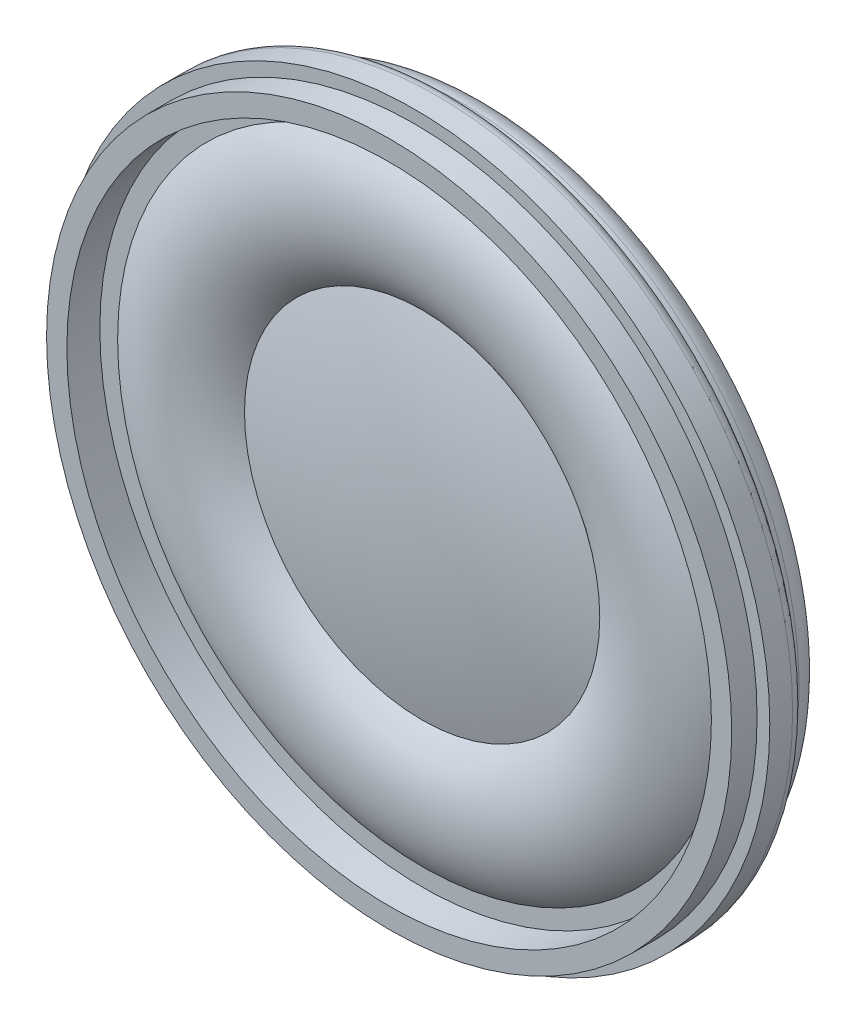
ISO-10303-21;
HEADER;
FILE_DESCRIPTION(('STEP AP214'),'2;1');
FILE_NAME('part.step','',(''),(''),'','','');
FILE_SCHEMA(('AUTOMOTIVE_DESIGN { 1 0 10303 214 1 1 1 1 }'));
ENDSEC;
DATA;
#1=APPLICATION_CONTEXT('core data for automotive mechanical design processes');
#2=APPLICATION_PROTOCOL_DEFINITION('international standard','automotive_design',2000,#1);
#3=PRODUCT_CONTEXT('',#1,'mechanical');
#4=PRODUCT('Part','Part','',(#3));
#5=PRODUCT_RELATED_PRODUCT_CATEGORY('part','',(#4));
#6=PRODUCT_DEFINITION_FORMATION('','',#4);
#7=PRODUCT_DEFINITION_CONTEXT('part definition',#1,'design');
#8=PRODUCT_DEFINITION('design','',#6,#7);
#9=PRODUCT_DEFINITION_SHAPE('','',#8);
#10=(LENGTH_UNIT() NAMED_UNIT(*) SI_UNIT(.MILLI.,.METRE.));
#11=(NAMED_UNIT(*) PLANE_ANGLE_UNIT() SI_UNIT($,.RADIAN.));
#12=(NAMED_UNIT(*) SI_UNIT($,.STERADIAN.) SOLID_ANGLE_UNIT());
#13=UNCERTAINTY_MEASURE_WITH_UNIT(LENGTH_MEASURE(1.E-05),#10,'distance_accuracy_value','');
#14=(GEOMETRIC_REPRESENTATION_CONTEXT(3) GLOBAL_UNCERTAINTY_ASSIGNED_CONTEXT((#13)) GLOBAL_UNIT_ASSIGNED_CONTEXT((#10,
#11,#12)) REPRESENTATION_CONTEXT('',''));
#15=CARTESIAN_POINT('',(0.,0.,0.));
#16=DIRECTION('',(0.,0.,1.));
#17=DIRECTION('',(1.,0.,0.));
#18=AXIS2_PLACEMENT_3D('',#15,#16,#17);
#19=CARTESIAN_POINT('',(8.,0.,1.5));
#20=DIRECTION('',(0.,0.,1.));
#21=DIRECTION('',(1.,0.,0.));
#22=AXIS2_PLACEMENT_3D('',#19,#20,#21);
#23=PLANE('',#22);
#24=CARTESIAN_POINT('',(0.,0.,1.5));
#25=DIRECTION('',(0.,0.,-1.));
#26=DIRECTION('',(-1.,0.,0.));
#27=AXIS2_PLACEMENT_3D('',#24,#25,#26);
#28=CIRCLE('',#27,12.25);
#29=CARTESIAN_POINT('',(-12.25,0.,1.5));
#30=VERTEX_POINT('',#29);
#31=EDGE_CURVE('E115',#30,#30,#28,.T.);
#32=ORIENTED_EDGE('',*,*,#31,.T.);
#33=EDGE_LOOP('',(#32));
#34=FACE_BOUND('',#33,.T.);
#35=CARTESIAN_POINT('',(0.,0.,1.5));
#36=DIRECTION('',(0.,0.,-1.));
#37=DIRECTION('',(-1.,0.,0.));
#38=AXIS2_PLACEMENT_3D('',#35,#36,#37);
#39=CIRCLE('',#38,8.);
#40=CARTESIAN_POINT('',(-8.,0.,1.5));
#41=VERTEX_POINT('',#40);
#42=EDGE_CURVE('E112',#41,#41,#39,.T.);
#43=ORIENTED_EDGE('',*,*,#42,.F.);
#44=EDGE_LOOP('',(#43));
#45=FACE_BOUND('',#44,.T.);
#46=CARTESIAN_POINT('',(0.,0.,1.5));
#47=DIRECTION('',(0.,0.,1.));
#48=DIRECTION('',(-1.,0.,0.));
#49=AXIS2_PLACEMENT_3D('',#46,#47,#48);
#50=CIRCLE('',#49,8.62499999999999);
#51=CARTESIAN_POINT('',(5.56451612903226,6.58990024581099,1.5));
#52=VERTEX_POINT('',#51);
#53=CARTESIAN_POINT('',(-5.56451612903225,6.58990024581099,1.5));
#54=VERTEX_POINT('',#53);
#55=EDGE_CURVE('E100',#52,#54,#50,.T.);
#56=ORIENTED_EDGE('',*,*,#55,.F.);
#57=DIRECTION('',(-0.645161290322581,-0.76404640531142,0.));
#58=VECTOR('',#57,1.);
#59=CARTESIAN_POINT('',(5.56451612903226,6.58990024581099,1.5));
#60=LINE('',#59,#58);
#61=CARTESIAN_POINT('',(7.5,8.88203946174525,1.5));
#62=VERTEX_POINT('',#61);
#63=EDGE_CURVE('E97',#62,#52,#60,.T.);
#64=ORIENTED_EDGE('',*,*,#63,.F.);
#65=CARTESIAN_POINT('',(0.,0.,1.5));
#66=DIRECTION('',(0.,0.,-1.));
#67=DIRECTION('',(-1.,0.,0.));
#68=AXIS2_PLACEMENT_3D('',#65,#66,#67);
#69=CIRCLE('',#68,11.625);
#70=CARTESIAN_POINT('',(-7.5,8.88203946174526,1.5));
#71=VERTEX_POINT('',#70);
#72=EDGE_CURVE('E59',#71,#62,#69,.T.);
#73=ORIENTED_EDGE('',*,*,#72,.F.);
#74=DIRECTION('',(-0.645161290322581,0.76404640531142,0.));
#75=VECTOR('',#74,1.);
#76=CARTESIAN_POINT('',(-5.56451612903226,6.58990024581099,1.5));
#77=LINE('',#76,#75);
#78=EDGE_CURVE('E54',#54,#71,#77,.T.);
#79=ORIENTED_EDGE('',*,*,#78,.F.);
#80=EDGE_LOOP('',(#56,#64,#73,#79));
#81=FACE_BOUND('',#80,.T.);
#82=ADVANCED_FACE('F39',(#34,#45,#81),#23,.F.);
#83=CARTESIAN_POINT('',(0.,0.,-22.6722222222223));
#84=DIRECTION('',(0.,0.,-1.));
#85=DIRECTION('',(1.,0.,0.));
#86=AXIS2_PLACEMENT_3D('',#83,#84,#85);
#87=SPHERICAL_SURFACE('',#86,27.6722222222223);
#88=CARTESIAN_POINT('',(0.,0.,4.1));
#89=DIRECTION('',(0.,0.,-1.));
#90=DIRECTION('',(-1.,0.,0.));
#91=AXIS2_PLACEMENT_3D('',#88,#89,#90);
#92=CIRCLE('',#91,7.);
#93=CARTESIAN_POINT('',(-7.,0.,4.1));
#94=VERTEX_POINT('',#93);
#95=EDGE_CURVE('E11',#94,#94,#92,.T.);
#96=ORIENTED_EDGE('',*,*,#95,.F.);
#97=EDGE_LOOP('',(#96));
#98=FACE_BOUND('',#97,.T.);
#99=ADVANCED_FACE('F41',(#98),#87,.T.);
#100=CARTESIAN_POINT('',(0.,0.,1.07777777777778));
#101=DIRECTION('',(0.,0.,-1.));
#102=DIRECTION('',(-1.,0.,0.));
#103=AXIS2_PLACEMENT_3D('',#100,#101,#102);
#104=TOROIDAL_SURFACE('',#103,9.5,3.92222222222222);
#105=CARTESIAN_POINT('',(0.,0.,4.1));
#106=DIRECTION('',(0.,0.,-1.));
#107=DIRECTION('',(-1.,0.,0.));
#108=AXIS2_PLACEMENT_3D('',#105,#106,#107);
#109=CIRCLE('',#108,12.);
#110=CARTESIAN_POINT('',(-12.,0.,4.1));
#111=VERTEX_POINT('',#110);
#112=EDGE_CURVE('E47',#111,#111,#109,.T.);
#113=ORIENTED_EDGE('',*,*,#112,.F.);
#114=EDGE_LOOP('',(#113));
#115=FACE_BOUND('',#114,.T.);
#116=ORIENTED_EDGE('',*,*,#95,.T.);
#117=EDGE_LOOP('',(#116));
#118=FACE_BOUND('',#117,.T.);
#119=ADVANCED_FACE('F149',(#115,#118),#104,.T.);
#120=CARTESIAN_POINT('',(12.7,0.,4.1));
#121=DIRECTION('',(0.,0.,-1.));
#122=DIRECTION('',(-1.,0.,0.));
#123=AXIS2_PLACEMENT_3D('',#120,#121,#122);
#124=PLANE('',#123);
#125=CARTESIAN_POINT('',(0.,0.,4.1));
#126=DIRECTION('',(0.,0.,-1.));
#127=DIRECTION('',(-1.,0.,0.));
#128=AXIS2_PLACEMENT_3D('',#125,#126,#127);
#129=CIRCLE('',#128,12.7);
#130=CARTESIAN_POINT('',(-12.7,0.,4.10000000000001));
#131=VERTEX_POINT('',#130);
#132=EDGE_CURVE('E142',#131,#131,#129,.T.);
#133=ORIENTED_EDGE('',*,*,#132,.F.);
#134=EDGE_LOOP('',(#133));
#135=FACE_BOUND('',#134,.T.);
#136=ORIENTED_EDGE('',*,*,#112,.T.);
#137=EDGE_LOOP('',(#136));
#138=FACE_BOUND('',#137,.T.);
#139=ADVANCED_FACE('F147',(#135,#138),#124,.F.);
#140=CARTESIAN_POINT('',(0.,0.,0.));
#141=DIRECTION('',(0.,0.,-1.));
#142=DIRECTION('',(-1.,0.,0.));
#143=AXIS2_PLACEMENT_3D('',#140,#141,#142);
#144=CYLINDRICAL_SURFACE('',#143,12.7);
#145=CARTESIAN_POINT('',(0.,0.,5.4));
#146=DIRECTION('',(0.,0.,-1.));
#147=DIRECTION('',(-1.,0.,0.));
#148=AXIS2_PLACEMENT_3D('',#145,#146,#147);
#149=CIRCLE('',#148,12.7);
#150=CARTESIAN_POINT('',(-12.7,0.,5.40000000000001));
#151=VERTEX_POINT('',#150);
#152=EDGE_CURVE('E139',#151,#151,#149,.T.);
#153=ORIENTED_EDGE('',*,*,#152,.F.);
#154=EDGE_LOOP('',(#153));
#155=FACE_BOUND('',#154,.T.);
#156=ORIENTED_EDGE('',*,*,#132,.T.);
#157=EDGE_LOOP('',(#156));
#158=FACE_BOUND('',#157,.T.);
#159=ADVANCED_FACE('F200',(#155,#158),#144,.F.);
#160=CARTESIAN_POINT('',(13.5,0.,5.4));
#161=DIRECTION('',(0.,0.,-1.));
#162=DIRECTION('',(-1.,0.,0.));
#163=AXIS2_PLACEMENT_3D('',#160,#161,#162);
#164=PLANE('',#163);
#165=CARTESIAN_POINT('',(0.,0.,5.4));
#166=DIRECTION('',(0.,0.,-1.));
#167=DIRECTION('',(-1.,0.,0.));
#168=AXIS2_PLACEMENT_3D('',#165,#166,#167);
#169=CIRCLE('',#168,13.5);
#170=CARTESIAN_POINT('',(-13.5,0.,5.40000000000001));
#171=VERTEX_POINT('',#170);
#172=EDGE_CURVE('E136',#171,#171,#169,.T.);
#173=ORIENTED_EDGE('',*,*,#172,.F.);
#174=EDGE_LOOP('',(#173));
#175=FACE_BOUND('',#174,.T.);
#176=ORIENTED_EDGE('',*,*,#152,.T.);
#177=EDGE_LOOP('',(#176));
#178=FACE_BOUND('',#177,.T.);
#179=ADVANCED_FACE('F196',(#175,#178),#164,.F.);
#180=CARTESIAN_POINT('',(0.,0.,0.));
#181=DIRECTION('',(0.,0.,-1.));
#182=DIRECTION('',(-1.,0.,0.));
#183=AXIS2_PLACEMENT_3D('',#180,#181,#182);
#184=CYLINDRICAL_SURFACE('',#183,13.5);
#185=CARTESIAN_POINT('',(0.,0.,4.4));
#186=DIRECTION('',(0.,0.,-1.));
#187=DIRECTION('',(-1.,0.,0.));
#188=AXIS2_PLACEMENT_3D('',#185,#186,#187);
#189=CIRCLE('',#188,13.5);
#190=CARTESIAN_POINT('',(-13.5,0.,4.4));
#191=VERTEX_POINT('',#190);
#192=EDGE_CURVE('E133',#191,#191,#189,.T.);
#193=ORIENTED_EDGE('',*,*,#192,.F.);
#194=EDGE_LOOP('',(#193));
#195=FACE_BOUND('',#194,.T.);
#196=ORIENTED_EDGE('',*,*,#172,.T.);
#197=EDGE_LOOP('',(#196));
#198=FACE_BOUND('',#197,.T.);
#199=ADVANCED_FACE('F192',(#195,#198),#184,.T.);
#200=CARTESIAN_POINT('',(14.,0.,4.4));
#201=DIRECTION('',(0.,0.,-1.));
#202=DIRECTION('',(-1.,0.,0.));
#203=AXIS2_PLACEMENT_3D('',#200,#201,#202);
#204=PLANE('',#203);
#205=CARTESIAN_POINT('',(0.,0.,4.4));
#206=DIRECTION('',(0.,0.,-1.));
#207=DIRECTION('',(-1.,0.,0.));
#208=AXIS2_PLACEMENT_3D('',#205,#206,#207);
#209=CIRCLE('',#208,14.);
#210=CARTESIAN_POINT('',(-14.,0.,4.4));
#211=VERTEX_POINT('',#210);
#212=EDGE_CURVE('E130',#211,#211,#209,.T.);
#213=ORIENTED_EDGE('',*,*,#212,.F.);
#214=EDGE_LOOP('',(#213));
#215=FACE_BOUND('',#214,.T.);
#216=ORIENTED_EDGE('',*,*,#192,.T.);
#217=EDGE_LOOP('',(#216));
#218=FACE_BOUND('',#217,.T.);
#219=ADVANCED_FACE('F188',(#215,#218),#204,.F.);
#220=CARTESIAN_POINT('',(0.,0.,0.));
#221=DIRECTION('',(0.,0.,-1.));
#222=DIRECTION('',(-1.,0.,0.));
#223=AXIS2_PLACEMENT_3D('',#220,#221,#222);
#224=CYLINDRICAL_SURFACE('',#223,14.);
#225=CARTESIAN_POINT('',(0.,0.,3.50000000000001));
#226=DIRECTION('',(0.,0.,-1.));
#227=DIRECTION('',(-1.,0.,0.));
#228=AXIS2_PLACEMENT_3D('',#225,#226,#227);
#229=CIRCLE('',#228,14.);
#230=CARTESIAN_POINT('',(-14.,0.,3.50000000000001));
#231=VERTEX_POINT('',#230);
#232=EDGE_CURVE('E127',#231,#231,#229,.T.);
#233=ORIENTED_EDGE('',*,*,#232,.F.);
#234=EDGE_LOOP('',(#233));
#235=FACE_BOUND('',#234,.T.);
#236=ORIENTED_EDGE('',*,*,#212,.T.);
#237=EDGE_LOOP('',(#236));
#238=FACE_BOUND('',#237,.T.);
#239=ADVANCED_FACE('F184',(#235,#238),#224,.T.);
#240=CARTESIAN_POINT('',(0.,0.,3.5));
#241=DIRECTION('',(0.,0.,-1.));
#242=DIRECTION('',(-1.,0.,0.));
#243=AXIS2_PLACEMENT_3D('',#240,#241,#242);
#244=TOROIDAL_SURFACE('',#243,13.5,0.5);
#245=CARTESIAN_POINT('',(0.,0.,3.));
#246=DIRECTION('',(0.,0.,-1.));
#247=DIRECTION('',(-1.,0.,0.));
#248=AXIS2_PLACEMENT_3D('',#245,#246,#247);
#249=CIRCLE('',#248,13.5);
#250=CARTESIAN_POINT('',(-13.5,0.,3.));
#251=VERTEX_POINT('',#250);
#252=EDGE_CURVE('E124',#251,#251,#249,.T.);
#253=ORIENTED_EDGE('',*,*,#252,.F.);
#254=EDGE_LOOP('',(#253));
#255=FACE_BOUND('',#254,.T.);
#256=ORIENTED_EDGE('',*,*,#232,.T.);
#257=EDGE_LOOP('',(#256));
#258=FACE_BOUND('',#257,.T.);
#259=ADVANCED_FACE('F180',(#255,#258),#244,.T.);
#260=CARTESIAN_POINT('',(13.25,0.,3.));
#261=DIRECTION('',(0.,0.,1.));
#262=DIRECTION('',(1.,0.,0.));
#263=AXIS2_PLACEMENT_3D('',#260,#261,#262);
#264=PLANE('',#263);
#265=CARTESIAN_POINT('',(0.,0.,3.));
#266=DIRECTION('',(0.,0.,-1.));
#267=DIRECTION('',(-1.,0.,0.));
#268=AXIS2_PLACEMENT_3D('',#265,#266,#267);
#269=CIRCLE('',#268,13.25);
#270=CARTESIAN_POINT('',(-13.25,0.,3.));
#271=VERTEX_POINT('',#270);
#272=EDGE_CURVE('E121',#271,#271,#269,.T.);
#273=ORIENTED_EDGE('',*,*,#272,.F.);
#274=EDGE_LOOP('',(#273));
#275=FACE_BOUND('',#274,.T.);
#276=ORIENTED_EDGE('',*,*,#252,.T.);
#277=EDGE_LOOP('',(#276));
#278=FACE_BOUND('',#277,.T.);
#279=ADVANCED_FACE('F176',(#275,#278),#264,.F.);
#280=CARTESIAN_POINT('',(0.,0.,0.));
#281=DIRECTION('',(0.,0.,-1.));
#282=DIRECTION('',(-1.,0.,0.));
#283=AXIS2_PLACEMENT_3D('',#280,#281,#282);
#284=CYLINDRICAL_SURFACE('',#283,13.25);
#285=CARTESIAN_POINT('',(0.,0.,2.50000000000001));
#286=DIRECTION('',(0.,0.,-1.));
#287=DIRECTION('',(-1.,0.,0.));
#288=AXIS2_PLACEMENT_3D('',#285,#286,#287);
#289=CIRCLE('',#288,13.25);
#290=CARTESIAN_POINT('',(-13.25,0.,2.50000000000001));
#291=VERTEX_POINT('',#290);
#292=EDGE_CURVE('E118',#291,#291,#289,.T.);
#293=ORIENTED_EDGE('',*,*,#292,.F.);
#294=EDGE_LOOP('',(#293));
#295=FACE_BOUND('',#294,.T.);
#296=ORIENTED_EDGE('',*,*,#272,.T.);
#297=EDGE_LOOP('',(#296));
#298=FACE_BOUND('',#297,.T.);
#299=ADVANCED_FACE('F172',(#295,#298),#284,.T.);
#300=CARTESIAN_POINT('',(0.,0.,2.5));
#301=DIRECTION('',(0.,0.,-1.));
#302=DIRECTION('',(-1.,0.,0.));
#303=AXIS2_PLACEMENT_3D('',#300,#301,#302);
#304=TOROIDAL_SURFACE('',#303,12.25,0.999999999999999);
#305=ORIENTED_EDGE('',*,*,#31,.F.);
#306=EDGE_LOOP('',(#305));
#307=FACE_BOUND('',#306,.T.);
#308=ORIENTED_EDGE('',*,*,#292,.T.);
#309=EDGE_LOOP('',(#308));
#310=FACE_BOUND('',#309,.T.);
#311=ADVANCED_FACE('F169',(#307,#310),#304,.T.);
#312=CARTESIAN_POINT('',(0.,0.,0.));
#313=DIRECTION('',(0.,0.,-1.));
#314=DIRECTION('',(-1.,0.,0.));
#315=AXIS2_PLACEMENT_3D('',#312,#313,#314);
#316=CYLINDRICAL_SURFACE('',#315,8.);
#317=CARTESIAN_POINT('',(0.,0.,0.500000000000005));
#318=DIRECTION('',(0.,0.,-1.));
#319=DIRECTION('',(-1.,0.,0.));
#320=AXIS2_PLACEMENT_3D('',#317,#318,#319);
#321=CIRCLE('',#320,8.);
#322=CARTESIAN_POINT('',(-8.,0.,0.500000000000006));
#323=VERTEX_POINT('',#322);
#324=EDGE_CURVE('E104',#323,#323,#321,.T.);
#325=ORIENTED_EDGE('',*,*,#324,.F.);
#326=EDGE_LOOP('',(#325));
#327=FACE_BOUND('',#326,.T.);
#328=ORIENTED_EDGE('',*,*,#42,.T.);
#329=EDGE_LOOP('',(#328));
#330=FACE_BOUND('',#329,.T.);
#331=ADVANCED_FACE('F167',(#327,#330),#316,.T.);
#332=CARTESIAN_POINT('',(0.,0.,0.500000000000001));
#333=DIRECTION('',(0.,0.,-1.));
#334=DIRECTION('',(-1.,0.,0.));
#335=AXIS2_PLACEMENT_3D('',#332,#333,#334);
#336=TOROIDAL_SURFACE('',#335,7.5,0.5);
#337=CARTESIAN_POINT('',(0.,0.,0.));
#338=DIRECTION('',(0.,0.,-1.));
#339=DIRECTION('',(-1.,0.,0.));
#340=AXIS2_PLACEMENT_3D('',#337,#338,#339);
#341=CIRCLE('',#340,7.5);
#342=CARTESIAN_POINT('',(-7.5,0.,0.));
#343=VERTEX_POINT('',#342);
#344=EDGE_CURVE('E101',#343,#343,#341,.T.);
#345=ORIENTED_EDGE('',*,*,#344,.F.);
#346=EDGE_LOOP('',(#345));
#347=FACE_BOUND('',#346,.T.);
#348=ORIENTED_EDGE('',*,*,#324,.T.);
#349=EDGE_LOOP('',(#348));
#350=FACE_BOUND('',#349,.T.);
#351=ADVANCED_FACE('F256',(#347,#350),#336,.T.);
#352=CARTESIAN_POINT('',(0.,0.,0.));
#353=DIRECTION('',(0.,0.,1.));
#354=DIRECTION('',(1.,0.,0.));
#355=AXIS2_PLACEMENT_3D('',#352,#353,#354);
#356=PLANE('',#355);
#357=ORIENTED_EDGE('',*,*,#344,.T.);
#358=EDGE_LOOP('',(#357));
#359=FACE_BOUND('',#358,.T.);
#360=ADVANCED_FACE('F263',(#359),#356,.F.);
#361=CARTESIAN_POINT('',(0.,0.,1.1));
#362=DIRECTION('',(0.,0.,1.));
#363=DIRECTION('',(1.,0.,0.));
#364=AXIS2_PLACEMENT_3D('',#361,#362,#363);
#365=CYLINDRICAL_SURFACE('',#364,8.62499999999999);
#366=ORIENTED_EDGE('',*,*,#55,.T.);
#367=DIRECTION('',(0.,0.,1.));
#368=VECTOR('',#367,1.);
#369=CARTESIAN_POINT('',(-5.56451612903226,6.58990024581099,1.1));
#370=LINE('',#369,#368);
#371=CARTESIAN_POINT('',(-5.56451612903226,6.58990024581099,1.1));
#372=VERTEX_POINT('',#371);
#373=EDGE_CURVE('E81',#372,#54,#370,.T.);
#374=ORIENTED_EDGE('',*,*,#373,.F.);
#375=CARTESIAN_POINT('',(0.,0.,1.1));
#376=DIRECTION('',(0.,0.,1.));
#377=DIRECTION('',(-1.,0.,0.));
#378=AXIS2_PLACEMENT_3D('',#375,#376,#377);
#379=CIRCLE('',#378,8.62499999999999);
#380=CARTESIAN_POINT('',(5.56451612903226,6.58990024581099,1.1));
#381=VERTEX_POINT('',#380);
#382=EDGE_CURVE('E88',#381,#372,#379,.T.);
#383=ORIENTED_EDGE('',*,*,#382,.F.);
#384=DIRECTION('',(0.,0.,1.));
#385=VECTOR('',#384,1.);
#386=CARTESIAN_POINT('',(5.56451612903226,6.58990024581099,1.1));
#387=LINE('',#386,#385);
#388=EDGE_CURVE('E321',#381,#52,#387,.T.);
#389=ORIENTED_EDGE('',*,*,#388,.T.);
#390=EDGE_LOOP('',(#366,#374,#383,#389));
#391=FACE_BOUND('',#390,.T.);
#392=ADVANCED_FACE('F99',(#391),#365,.F.);
#393=CARTESIAN_POINT('',(-5.56451612903226,6.58990024581099,1.1));
#394=DIRECTION('',(0.76404640531142,0.645161290322581,0.));
#395=DIRECTION('',(-0.645161290322581,0.76404640531142,0.));
#396=AXIS2_PLACEMENT_3D('',#393,#394,#395);
#397=PLANE('',#396);
#398=ORIENTED_EDGE('',*,*,#78,.T.);
#399=DIRECTION('',(0.,0.,1.));
#400=VECTOR('',#399,1.);
#401=CARTESIAN_POINT('',(-7.5,8.88203946174526,1.1));
#402=LINE('',#401,#400);
#403=CARTESIAN_POINT('',(-7.5,8.88203946174526,1.1));
#404=VERTEX_POINT('',#403);
#405=EDGE_CURVE('E84',#404,#71,#402,.T.);
#406=ORIENTED_EDGE('',*,*,#405,.F.);
#407=DIRECTION('',(-0.645161290322581,0.76404640531142,0.));
#408=VECTOR('',#407,1.);
#409=CARTESIAN_POINT('',(-5.56451612903226,6.58990024581099,1.1));
#410=LINE('',#409,#408);
#411=EDGE_CURVE('E77',#372,#404,#410,.T.);
#412=ORIENTED_EDGE('',*,*,#411,.F.);
#413=ORIENTED_EDGE('',*,*,#373,.T.);
#414=EDGE_LOOP('',(#398,#406,#412,#413));
#415=FACE_BOUND('',#414,.T.);
#416=ADVANCED_FACE('F79',(#415),#397,.F.);
#417=CARTESIAN_POINT('',(0.,0.,1.1));
#418=DIRECTION('',(0.,0.,1.));
#419=DIRECTION('',(1.,0.,0.));
#420=AXIS2_PLACEMENT_3D('',#417,#418,#419);
#421=CYLINDRICAL_SURFACE('',#420,11.625);
#422=ORIENTED_EDGE('',*,*,#72,.T.);
#423=DIRECTION('',(0.,0.,1.));
#424=VECTOR('',#423,1.);
#425=CARTESIAN_POINT('',(7.5,8.88203946174525,1.1));
#426=LINE('',#425,#424);
#427=CARTESIAN_POINT('',(7.5,8.88203946174525,1.1));
#428=VERTEX_POINT('',#427);
#429=EDGE_CURVE('E106',#428,#62,#426,.T.);
#430=ORIENTED_EDGE('',*,*,#429,.F.);
#431=CARTESIAN_POINT('',(0.,0.,1.1));
#432=DIRECTION('',(0.,0.,-1.));
#433=DIRECTION('',(-1.,0.,0.));
#434=AXIS2_PLACEMENT_3D('',#431,#432,#433);
#435=CIRCLE('',#434,11.625);
#436=EDGE_CURVE('E87',#404,#428,#435,.T.);
#437=ORIENTED_EDGE('',*,*,#436,.F.);
#438=ORIENTED_EDGE('',*,*,#405,.T.);
#439=EDGE_LOOP('',(#422,#430,#437,#438));
#440=FACE_BOUND('',#439,.T.);
#441=ADVANCED_FACE('F285',(#440),#421,.T.);
#442=CARTESIAN_POINT('',(5.56451612903226,6.58990024581099,1.1));
#443=DIRECTION('',(-0.76404640531142,0.645161290322581,0.));
#444=DIRECTION('',(-0.645161290322581,-0.76404640531142,0.));
#445=AXIS2_PLACEMENT_3D('',#442,#443,#444);
#446=PLANE('',#445);
#447=ORIENTED_EDGE('',*,*,#63,.T.);
#448=ORIENTED_EDGE('',*,*,#388,.F.);
#449=DIRECTION('',(-0.645161290322581,-0.76404640531142,0.));
#450=VECTOR('',#449,1.);
#451=CARTESIAN_POINT('',(5.56451612903226,6.58990024581099,1.1));
#452=LINE('',#451,#450);
#453=EDGE_CURVE('E93',#428,#381,#452,.T.);
#454=ORIENTED_EDGE('',*,*,#453,.F.);
#455=ORIENTED_EDGE('',*,*,#429,.T.);
#456=EDGE_LOOP('',(#447,#448,#454,#455));
#457=FACE_BOUND('',#456,.T.);
#458=ADVANCED_FACE('F292',(#457),#446,.F.);
#459=CARTESIAN_POINT('',(0.,0.,1.1));
#460=DIRECTION('',(0.,0.,-1.));
#461=DIRECTION('',(-1.,0.,0.));
#462=AXIS2_PLACEMENT_3D('',#459,#460,#461);
#463=PLANE('',#462);
#464=ORIENTED_EDGE('',*,*,#382,.T.);
#465=ORIENTED_EDGE('',*,*,#411,.T.);
#466=ORIENTED_EDGE('',*,*,#436,.T.);
#467=ORIENTED_EDGE('',*,*,#453,.T.);
#468=EDGE_LOOP('',(#464,#465,#466,#467));
#469=FACE_BOUND('',#468,.T.);
#470=ADVANCED_FACE('F91',(#469),#463,.T.);
#471=CLOSED_SHELL('',(#82,#99,#119,#139,#159,#179,#199,#219,#239,#259,#279,#299,#311,#331,#351,
#360,#392,#416,#441,#458,#470));
#472=MANIFOLD_SOLID_BREP('B2',#471);
#473=ADVANCED_BREP_SHAPE_REPRESENTATION('',(#18,#472),#14);
#474=SHAPE_DEFINITION_REPRESENTATION(#9,#473);
ENDSEC;
END-ISO-10303-21;
